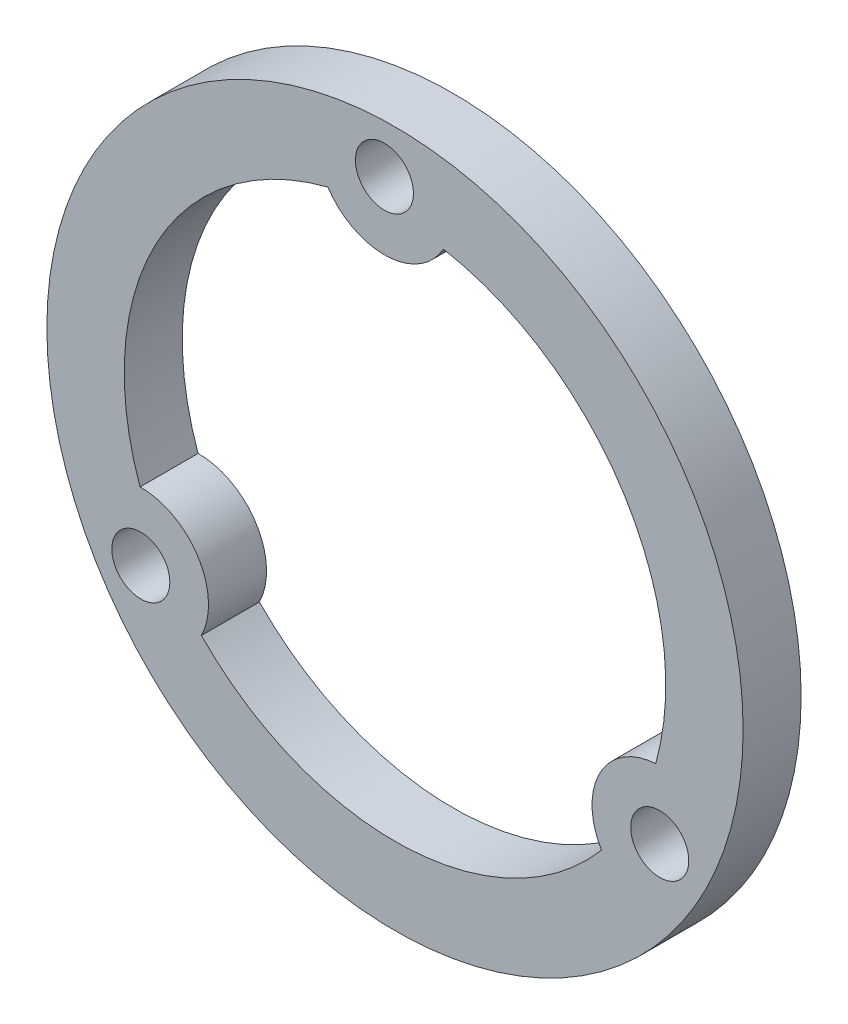
ISO-10303-21;
HEADER;
FILE_DESCRIPTION(('STEP AP214'),'2;1');
FILE_NAME('part.step','',(''),(''),'','','');
FILE_SCHEMA(('AUTOMOTIVE_DESIGN { 1 0 10303 214 1 1 1 1 }'));
ENDSEC;
DATA;
#1=APPLICATION_CONTEXT('core data for automotive mechanical design processes');
#2=APPLICATION_PROTOCOL_DEFINITION('international standard','automotive_design',2000,#1);
#3=PRODUCT_CONTEXT('',#1,'mechanical');
#4=PRODUCT('Part','Part','',(#3));
#5=PRODUCT_RELATED_PRODUCT_CATEGORY('part','',(#4));
#6=PRODUCT_DEFINITION_FORMATION('','',#4);
#7=PRODUCT_DEFINITION_CONTEXT('part definition',#1,'design');
#8=PRODUCT_DEFINITION('design','',#6,#7);
#9=PRODUCT_DEFINITION_SHAPE('','',#8);
#10=(LENGTH_UNIT() NAMED_UNIT(*) SI_UNIT(.MILLI.,.METRE.));
#11=(NAMED_UNIT(*) PLANE_ANGLE_UNIT() SI_UNIT($,.RADIAN.));
#12=(NAMED_UNIT(*) SI_UNIT($,.STERADIAN.) SOLID_ANGLE_UNIT());
#13=UNCERTAINTY_MEASURE_WITH_UNIT(LENGTH_MEASURE(1.E-05),#10,'distance_accuracy_value','');
#14=(GEOMETRIC_REPRESENTATION_CONTEXT(3) GLOBAL_UNCERTAINTY_ASSIGNED_CONTEXT((#13)) GLOBAL_UNIT_ASSIGNED_CONTEXT((#10,
#11,#12)) REPRESENTATION_CONTEXT('',''));
#15=CARTESIAN_POINT('',(0.,0.,0.));
#16=DIRECTION('',(0.,0.,1.));
#17=DIRECTION('',(1.,0.,0.));
#18=AXIS2_PLACEMENT_3D('',#15,#16,#17);
#19=CARTESIAN_POINT('',(0.,0.,3.));
#20=DIRECTION('',(0.,0.,1.));
#21=DIRECTION('',(1.,0.,0.));
#22=AXIS2_PLACEMENT_3D('',#19,#20,#21);
#23=PLANE('',#22);
#24=CARTESIAN_POINT('',(-13.1416847795504,-8.21864472738256,3.));
#25=DIRECTION('',(0.,0.,1.));
#26=DIRECTION('',(1.,0.,0.));
#27=AXIS2_PLACEMENT_3D('',#24,#25,#26);
#28=CIRCLE('',#27,1.5);
#29=CARTESIAN_POINT('',(-11.6416847795504,-8.21864472738256,3.));
#30=VERTEX_POINT('',#29);
#31=EDGE_CURVE('E247',#30,#30,#28,.T.);
#32=ORIENTED_EDGE('',*,*,#31,.F.);
#33=EDGE_LOOP('',(#32));
#34=FACE_BOUND('',#33,.T.);
#35=CARTESIAN_POINT('',(13.6883975083675,-7.2717105039268,3.));
#36=DIRECTION('',(0.,0.,-1.));
#37=DIRECTION('',(1.,0.,0.));
#38=AXIS2_PLACEMENT_3D('',#35,#36,#37);
#39=CIRCLE('',#38,3.5);
#40=CARTESIAN_POINT('',(10.6770331705431,-9.0554382928228,3.));
#41=VERTEX_POINT('',#40);
#42=CARTESIAN_POINT('',(13.4806381865757,-3.77788222191169,3.));
#43=VERTEX_POINT('',#42);
#44=EDGE_CURVE('E94',#41,#43,#39,.T.);
#45=ORIENTED_EDGE('',*,*,#44,.F.);
#46=CARTESIAN_POINT('',(0.,0.,3.));
#47=DIRECTION('',(0.,0.,1.));
#48=DIRECTION('',(1.,0.,0.));
#49=AXIS2_PLACEMENT_3D('',#46,#47,#48);
#50=CIRCLE('',#49,14.);
#51=CARTESIAN_POINT('',(-10.0120610699689,-9.78563401784541,3.));
#52=VERTEX_POINT('',#51);
#53=EDGE_CURVE('E86',#52,#41,#50,.T.);
#54=ORIENTED_EDGE('',*,*,#53,.F.);
#55=CARTESIAN_POINT('',(-13.1416847795504,-8.21864472738256,3.));
#56=DIRECTION('',(0.,0.,-1.));
#57=DIRECTION('',(1.,0.,0.));
#58=AXIS2_PLACEMENT_3D('',#55,#56,#57);
#59=CIRCLE('',#58,3.5);
#60=CARTESIAN_POINT('',(-13.1807561892585,-4.71886281632819,3.));
#61=VERTEX_POINT('',#60);
#62=EDGE_CURVE('E116',#61,#52,#59,.T.);
#63=ORIENTED_EDGE('',*,*,#62,.F.);
#64=CARTESIAN_POINT('',(0.,0.,3.));
#65=DIRECTION('',(0.,0.,1.));
#66=DIRECTION('',(1.,0.,0.));
#67=AXIS2_PLACEMENT_3D('',#64,#65,#66);
#68=CIRCLE('',#67,14.);
#69=CARTESIAN_POINT('',(-3.46857711660661,13.563516239757,3.));
#70=VERTEX_POINT('',#69);
#71=EDGE_CURVE('E114',#70,#61,#68,.T.);
#72=ORIENTED_EDGE('',*,*,#71,.F.);
#73=CARTESIAN_POINT('',(-0.546712728816841,15.4903552313092,3.));
#74=DIRECTION('',(0.,0.,-1.));
#75=DIRECTION('',(1.,0.,0.));
#76=AXIS2_PLACEMENT_3D('',#73,#74,#75);
#77=CIRCLE('',#76,3.5);
#78=CARTESIAN_POINT('',(2.5037230187155,13.7743011091508,3.));
#79=VERTEX_POINT('',#78);
#80=EDGE_CURVE('E109',#79,#70,#77,.T.);
#81=ORIENTED_EDGE('',*,*,#80,.F.);
#82=CARTESIAN_POINT('',(0.,0.,3.));
#83=DIRECTION('',(0.,0.,1.));
#84=DIRECTION('',(1.,0.,0.));
#85=AXIS2_PLACEMENT_3D('',#82,#83,#84);
#86=CIRCLE('',#85,14.);
#87=EDGE_CURVE('E107',#43,#79,#86,.T.);
#88=ORIENTED_EDGE('',*,*,#87,.F.);
#89=EDGE_LOOP('',(#45,#54,#63,#72,#81,#88));
#90=FACE_BOUND('',#89,.T.);
#91=CARTESIAN_POINT('',(0.,0.,3.));
#92=DIRECTION('',(0.,0.,1.));
#93=DIRECTION('',(1.,0.,0.));
#94=AXIS2_PLACEMENT_3D('',#91,#92,#93);
#95=CIRCLE('',#94,18.);
#96=CARTESIAN_POINT('',(18.,0.,3.));
#97=VERTEX_POINT('',#96);
#98=EDGE_CURVE('E11',#97,#97,#95,.T.);
#99=ORIENTED_EDGE('',*,*,#98,.T.);
#100=EDGE_LOOP('',(#99));
#101=FACE_BOUND('',#100,.T.);
#102=CARTESIAN_POINT('',(-0.546712728816841,15.4903552313092,3.));
#103=DIRECTION('',(0.,0.,1.));
#104=DIRECTION('',(1.,0.,0.));
#105=AXIS2_PLACEMENT_3D('',#102,#103,#104);
#106=CIRCLE('',#105,1.5);
#107=CARTESIAN_POINT('',(0.953287271183161,15.4903552313092,3.));
#108=VERTEX_POINT('',#107);
#109=EDGE_CURVE('E119',#108,#108,#106,.T.);
#110=ORIENTED_EDGE('',*,*,#109,.F.);
#111=EDGE_LOOP('',(#110));
#112=FACE_BOUND('',#111,.T.);
#113=CARTESIAN_POINT('',(13.6883975083675,-7.2717105039268,3.));
#114=DIRECTION('',(0.,0.,1.));
#115=DIRECTION('',(1.,0.,0.));
#116=AXIS2_PLACEMENT_3D('',#113,#114,#115);
#117=CIRCLE('',#116,1.5);
#118=CARTESIAN_POINT('',(15.1883975083675,-7.2717105039268,3.));
#119=VERTEX_POINT('',#118);
#120=EDGE_CURVE('E238',#119,#119,#117,.T.);
#121=ORIENTED_EDGE('',*,*,#120,.F.);
#122=EDGE_LOOP('',(#121));
#123=FACE_BOUND('',#122,.T.);
#124=ADVANCED_FACE('F33',(#34,#90,#101,#112,#123),#23,.T.);
#125=CARTESIAN_POINT('',(0.,0.,0.));
#126=DIRECTION('',(0.,0.,1.));
#127=DIRECTION('',(1.,0.,0.));
#128=AXIS2_PLACEMENT_3D('',#125,#126,#127);
#129=PLANE('',#128);
#130=CARTESIAN_POINT('',(0.,0.,0.));
#131=DIRECTION('',(0.,0.,1.));
#132=DIRECTION('',(1.,0.,0.));
#133=AXIS2_PLACEMENT_3D('',#130,#131,#132);
#134=CIRCLE('',#133,18.);
#135=CARTESIAN_POINT('',(18.,0.,0.));
#136=VERTEX_POINT('',#135);
#137=EDGE_CURVE('E37',#136,#136,#134,.T.);
#138=ORIENTED_EDGE('',*,*,#137,.F.);
#139=EDGE_LOOP('',(#138));
#140=FACE_BOUND('',#139,.T.);
#141=CARTESIAN_POINT('',(0.,0.,0.));
#142=DIRECTION('',(0.,0.,1.));
#143=DIRECTION('',(1.,0.,0.));
#144=AXIS2_PLACEMENT_3D('',#141,#142,#143);
#145=CIRCLE('',#144,14.);
#146=CARTESIAN_POINT('',(-10.0120610699689,-9.78563401784541,0.));
#147=VERTEX_POINT('',#146);
#148=CARTESIAN_POINT('',(10.6770331705431,-9.0554382928228,0.));
#149=VERTEX_POINT('',#148);
#150=EDGE_CURVE('E56',#147,#149,#145,.T.);
#151=ORIENTED_EDGE('',*,*,#150,.T.);
#152=CARTESIAN_POINT('',(13.6883975083675,-7.2717105039268,0.));
#153=DIRECTION('',(0.,0.,-1.));
#154=DIRECTION('',(1.,0.,0.));
#155=AXIS2_PLACEMENT_3D('',#152,#153,#154);
#156=CIRCLE('',#155,3.5);
#157=CARTESIAN_POINT('',(13.4806381865757,-3.77788222191169,0.));
#158=VERTEX_POINT('',#157);
#159=EDGE_CURVE('E101',#149,#158,#156,.T.);
#160=ORIENTED_EDGE('',*,*,#159,.T.);
#161=CARTESIAN_POINT('',(0.,0.,0.));
#162=DIRECTION('',(0.,0.,1.));
#163=DIRECTION('',(1.,0.,0.));
#164=AXIS2_PLACEMENT_3D('',#161,#162,#163);
#165=CIRCLE('',#164,14.);
#166=CARTESIAN_POINT('',(2.5037230187155,13.7743011091508,0.));
#167=VERTEX_POINT('',#166);
#168=EDGE_CURVE('E121',#158,#167,#165,.T.);
#169=ORIENTED_EDGE('',*,*,#168,.T.);
#170=CARTESIAN_POINT('',(-0.546712728816841,15.4903552313092,0.));
#171=DIRECTION('',(0.,0.,-1.));
#172=DIRECTION('',(1.,0.,0.));
#173=AXIS2_PLACEMENT_3D('',#170,#171,#172);
#174=CIRCLE('',#173,3.5);
#175=CARTESIAN_POINT('',(-3.46857711660661,13.563516239757,0.));
#176=VERTEX_POINT('',#175);
#177=EDGE_CURVE('E124',#167,#176,#174,.T.);
#178=ORIENTED_EDGE('',*,*,#177,.T.);
#179=CARTESIAN_POINT('',(0.,0.,0.));
#180=DIRECTION('',(0.,0.,1.));
#181=DIRECTION('',(1.,0.,0.));
#182=AXIS2_PLACEMENT_3D('',#179,#180,#181);
#183=CIRCLE('',#182,14.);
#184=CARTESIAN_POINT('',(-13.1807561892585,-4.71886281632818,0.));
#185=VERTEX_POINT('',#184);
#186=EDGE_CURVE('E127',#176,#185,#183,.T.);
#187=ORIENTED_EDGE('',*,*,#186,.T.);
#188=CARTESIAN_POINT('',(-13.1416847795504,-8.21864472738256,0.));
#189=DIRECTION('',(0.,0.,-1.));
#190=DIRECTION('',(1.,0.,0.));
#191=AXIS2_PLACEMENT_3D('',#188,#189,#190);
#192=CIRCLE('',#191,3.5);
#193=EDGE_CURVE('E95',#185,#147,#192,.T.);
#194=ORIENTED_EDGE('',*,*,#193,.T.);
#195=EDGE_LOOP('',(#151,#160,#169,#178,#187,#194));
#196=FACE_BOUND('',#195,.T.);
#197=CARTESIAN_POINT('',(-0.546712728816841,15.4903552313092,0.));
#198=DIRECTION('',(0.,0.,1.));
#199=DIRECTION('',(1.,0.,0.));
#200=AXIS2_PLACEMENT_3D('',#197,#198,#199);
#201=CIRCLE('',#200,1.5);
#202=CARTESIAN_POINT('',(0.953287271183161,15.4903552313092,0.));
#203=VERTEX_POINT('',#202);
#204=EDGE_CURVE('E250',#203,#203,#201,.T.);
#205=ORIENTED_EDGE('',*,*,#204,.T.);
#206=EDGE_LOOP('',(#205));
#207=FACE_BOUND('',#206,.T.);
#208=CARTESIAN_POINT('',(-13.1416847795504,-8.21864472738256,0.));
#209=DIRECTION('',(0.,0.,1.));
#210=DIRECTION('',(1.,0.,0.));
#211=AXIS2_PLACEMENT_3D('',#208,#209,#210);
#212=CIRCLE('',#211,1.5);
#213=CARTESIAN_POINT('',(-11.6416847795504,-8.21864472738256,0.));
#214=VERTEX_POINT('',#213);
#215=EDGE_CURVE('E244',#214,#214,#212,.T.);
#216=ORIENTED_EDGE('',*,*,#215,.T.);
#217=EDGE_LOOP('',(#216));
#218=FACE_BOUND('',#217,.T.);
#219=CARTESIAN_POINT('',(13.6883975083675,-7.2717105039268,0.));
#220=DIRECTION('',(0.,0.,1.));
#221=DIRECTION('',(1.,0.,0.));
#222=AXIS2_PLACEMENT_3D('',#219,#220,#221);
#223=CIRCLE('',#222,1.5);
#224=CARTESIAN_POINT('',(15.1883975083675,-7.2717105039268,0.));
#225=VERTEX_POINT('',#224);
#226=EDGE_CURVE('E241',#225,#225,#223,.T.);
#227=ORIENTED_EDGE('',*,*,#226,.T.);
#228=EDGE_LOOP('',(#227));
#229=FACE_BOUND('',#228,.T.);
#230=ADVANCED_FACE('F144',(#140,#196,#207,#218,#229),#129,.F.);
#231=CARTESIAN_POINT('',(0.,0.,3.));
#232=DIRECTION('',(0.,0.,-1.));
#233=DIRECTION('',(-1.,0.,0.));
#234=AXIS2_PLACEMENT_3D('',#231,#232,#233);
#235=CYLINDRICAL_SURFACE('',#234,18.);
#236=ORIENTED_EDGE('',*,*,#98,.F.);
#237=EDGE_LOOP('',(#236));
#238=FACE_BOUND('',#237,.T.);
#239=ORIENTED_EDGE('',*,*,#137,.T.);
#240=EDGE_LOOP('',(#239));
#241=FACE_BOUND('',#240,.T.);
#242=ADVANCED_FACE('F35',(#238,#241),#235,.T.);
#243=CARTESIAN_POINT('',(0.,0.,3.));
#244=DIRECTION('',(0.,0.,-1.));
#245=DIRECTION('',(-1.,0.,0.));
#246=AXIS2_PLACEMENT_3D('',#243,#244,#245);
#247=CYLINDRICAL_SURFACE('',#246,14.);
#248=ORIENTED_EDGE('',*,*,#150,.F.);
#249=DIRECTION('',(0.,0.,-1.));
#250=VECTOR('',#249,1.);
#251=CARTESIAN_POINT('',(-10.0120610699689,-9.78563401784541,3.));
#252=LINE('',#251,#250);
#253=EDGE_CURVE('E90',#52,#147,#252,.T.);
#254=ORIENTED_EDGE('',*,*,#253,.F.);
#255=ORIENTED_EDGE('',*,*,#53,.T.);
#256=DIRECTION('',(0.,0.,-1.));
#257=VECTOR('',#256,1.);
#258=CARTESIAN_POINT('',(10.6770331705431,-9.0554382928228,3.));
#259=LINE('',#258,#257);
#260=EDGE_CURVE('E89',#41,#149,#259,.T.);
#261=ORIENTED_EDGE('',*,*,#260,.T.);
#262=EDGE_LOOP('',(#248,#254,#255,#261));
#263=FACE_BOUND('',#262,.T.);
#264=ADVANCED_FACE('F88',(#263),#247,.F.);
#265=CARTESIAN_POINT('',(13.6883975083675,-7.2717105039268,3.));
#266=DIRECTION('',(0.,0.,-1.));
#267=DIRECTION('',(-1.,0.,0.));
#268=AXIS2_PLACEMENT_3D('',#265,#266,#267);
#269=CYLINDRICAL_SURFACE('',#268,3.5);
#270=ORIENTED_EDGE('',*,*,#159,.F.);
#271=ORIENTED_EDGE('',*,*,#260,.F.);
#272=ORIENTED_EDGE('',*,*,#44,.T.);
#273=DIRECTION('',(0.,0.,-1.));
#274=VECTOR('',#273,1.);
#275=CARTESIAN_POINT('',(13.4806381865757,-3.77788222191169,3.));
#276=LINE('',#275,#274);
#277=EDGE_CURVE('E102',#43,#158,#276,.T.);
#278=ORIENTED_EDGE('',*,*,#277,.T.);
#279=EDGE_LOOP('',(#270,#271,#272,#278));
#280=FACE_BOUND('',#279,.T.);
#281=ADVANCED_FACE('F98',(#280),#269,.T.);
#282=CARTESIAN_POINT('',(0.,0.,3.));
#283=DIRECTION('',(0.,0.,-1.));
#284=DIRECTION('',(-1.,0.,0.));
#285=AXIS2_PLACEMENT_3D('',#282,#283,#284);
#286=CYLINDRICAL_SURFACE('',#285,14.);
#287=ORIENTED_EDGE('',*,*,#168,.F.);
#288=ORIENTED_EDGE('',*,*,#277,.F.);
#289=ORIENTED_EDGE('',*,*,#87,.T.);
#290=DIRECTION('',(0.,0.,-1.));
#291=VECTOR('',#290,1.);
#292=CARTESIAN_POINT('',(2.5037230187155,13.7743011091508,3.));
#293=LINE('',#292,#291);
#294=EDGE_CURVE('E136',#79,#167,#293,.T.);
#295=ORIENTED_EDGE('',*,*,#294,.T.);
#296=EDGE_LOOP('',(#287,#288,#289,#295));
#297=FACE_BOUND('',#296,.T.);
#298=ADVANCED_FACE('F140',(#297),#286,.F.);
#299=CARTESIAN_POINT('',(-0.546712728816841,15.4903552313092,3.));
#300=DIRECTION('',(0.,0.,-1.));
#301=DIRECTION('',(-1.,0.,0.));
#302=AXIS2_PLACEMENT_3D('',#299,#300,#301);
#303=CYLINDRICAL_SURFACE('',#302,3.5);
#304=ORIENTED_EDGE('',*,*,#177,.F.);
#305=ORIENTED_EDGE('',*,*,#294,.F.);
#306=ORIENTED_EDGE('',*,*,#80,.T.);
#307=DIRECTION('',(0.,0.,-1.));
#308=VECTOR('',#307,1.);
#309=CARTESIAN_POINT('',(-3.46857711660661,13.563516239757,3.));
#310=LINE('',#309,#308);
#311=EDGE_CURVE('E134',#70,#176,#310,.T.);
#312=ORIENTED_EDGE('',*,*,#311,.T.);
#313=EDGE_LOOP('',(#304,#305,#306,#312));
#314=FACE_BOUND('',#313,.T.);
#315=ADVANCED_FACE('F153',(#314),#303,.T.);
#316=CARTESIAN_POINT('',(0.,0.,3.));
#317=DIRECTION('',(0.,0.,-1.));
#318=DIRECTION('',(-1.,0.,0.));
#319=AXIS2_PLACEMENT_3D('',#316,#317,#318);
#320=CYLINDRICAL_SURFACE('',#319,14.);
#321=ORIENTED_EDGE('',*,*,#186,.F.);
#322=ORIENTED_EDGE('',*,*,#311,.F.);
#323=ORIENTED_EDGE('',*,*,#71,.T.);
#324=DIRECTION('',(0.,0.,-1.));
#325=VECTOR('',#324,1.);
#326=CARTESIAN_POINT('',(-13.1807561892585,-4.71886281632818,3.));
#327=LINE('',#326,#325);
#328=EDGE_CURVE('E48',#61,#185,#327,.T.);
#329=ORIENTED_EDGE('',*,*,#328,.T.);
#330=EDGE_LOOP('',(#321,#322,#323,#329));
#331=FACE_BOUND('',#330,.T.);
#332=ADVANCED_FACE('F151',(#331),#320,.F.);
#333=CARTESIAN_POINT('',(-13.1416847795504,-8.21864472738256,3.));
#334=DIRECTION('',(0.,0.,-1.));
#335=DIRECTION('',(-1.,0.,0.));
#336=AXIS2_PLACEMENT_3D('',#333,#334,#335);
#337=CYLINDRICAL_SURFACE('',#336,3.5);
#338=ORIENTED_EDGE('',*,*,#193,.F.);
#339=ORIENTED_EDGE('',*,*,#328,.F.);
#340=ORIENTED_EDGE('',*,*,#62,.T.);
#341=ORIENTED_EDGE('',*,*,#253,.T.);
#342=EDGE_LOOP('',(#338,#339,#340,#341));
#343=FACE_BOUND('',#342,.T.);
#344=ADVANCED_FACE('F147',(#343),#337,.T.);
#345=CARTESIAN_POINT('',(-0.546712728816841,15.4903552313092,3.));
#346=DIRECTION('',(0.,0.,-1.));
#347=DIRECTION('',(-1.,0.,0.));
#348=AXIS2_PLACEMENT_3D('',#345,#346,#347);
#349=CYLINDRICAL_SURFACE('',#348,1.5);
#350=ORIENTED_EDGE('',*,*,#109,.T.);
#351=EDGE_LOOP('',(#350));
#352=FACE_BOUND('',#351,.T.);
#353=ORIENTED_EDGE('',*,*,#204,.F.);
#354=EDGE_LOOP('',(#353));
#355=FACE_BOUND('',#354,.T.);
#356=ADVANCED_FACE('F202',(#352,#355),#349,.F.);
#357=CARTESIAN_POINT('',(-13.1416847795504,-8.21864472738256,3.));
#358=DIRECTION('',(0.,0.,-1.));
#359=DIRECTION('',(-1.,0.,0.));
#360=AXIS2_PLACEMENT_3D('',#357,#358,#359);
#361=CYLINDRICAL_SURFACE('',#360,1.5);
#362=ORIENTED_EDGE('',*,*,#31,.T.);
#363=EDGE_LOOP('',(#362));
#364=FACE_BOUND('',#363,.T.);
#365=ORIENTED_EDGE('',*,*,#215,.F.);
#366=EDGE_LOOP('',(#365));
#367=FACE_BOUND('',#366,.T.);
#368=ADVANCED_FACE('F211',(#364,#367),#361,.F.);
#369=CARTESIAN_POINT('',(13.6883975083675,-7.2717105039268,3.));
#370=DIRECTION('',(0.,0.,-1.));
#371=DIRECTION('',(-1.,0.,0.));
#372=AXIS2_PLACEMENT_3D('',#369,#370,#371);
#373=CYLINDRICAL_SURFACE('',#372,1.5);
#374=ORIENTED_EDGE('',*,*,#120,.T.);
#375=EDGE_LOOP('',(#374));
#376=FACE_BOUND('',#375,.T.);
#377=ORIENTED_EDGE('',*,*,#226,.F.);
#378=EDGE_LOOP('',(#377));
#379=FACE_BOUND('',#378,.T.);
#380=ADVANCED_FACE('F221',(#376,#379),#373,.F.);
#381=CLOSED_SHELL('',(#124,#230,#242,#264,#281,#298,#315,#332,#344,#356,#368,#380));
#382=MANIFOLD_SOLID_BREP('B2',#381);
#383=ADVANCED_BREP_SHAPE_REPRESENTATION('',(#18,#382),#14);
#384=SHAPE_DEFINITION_REPRESENTATION(#9,#383);
ENDSEC;
END-ISO-10303-21;
